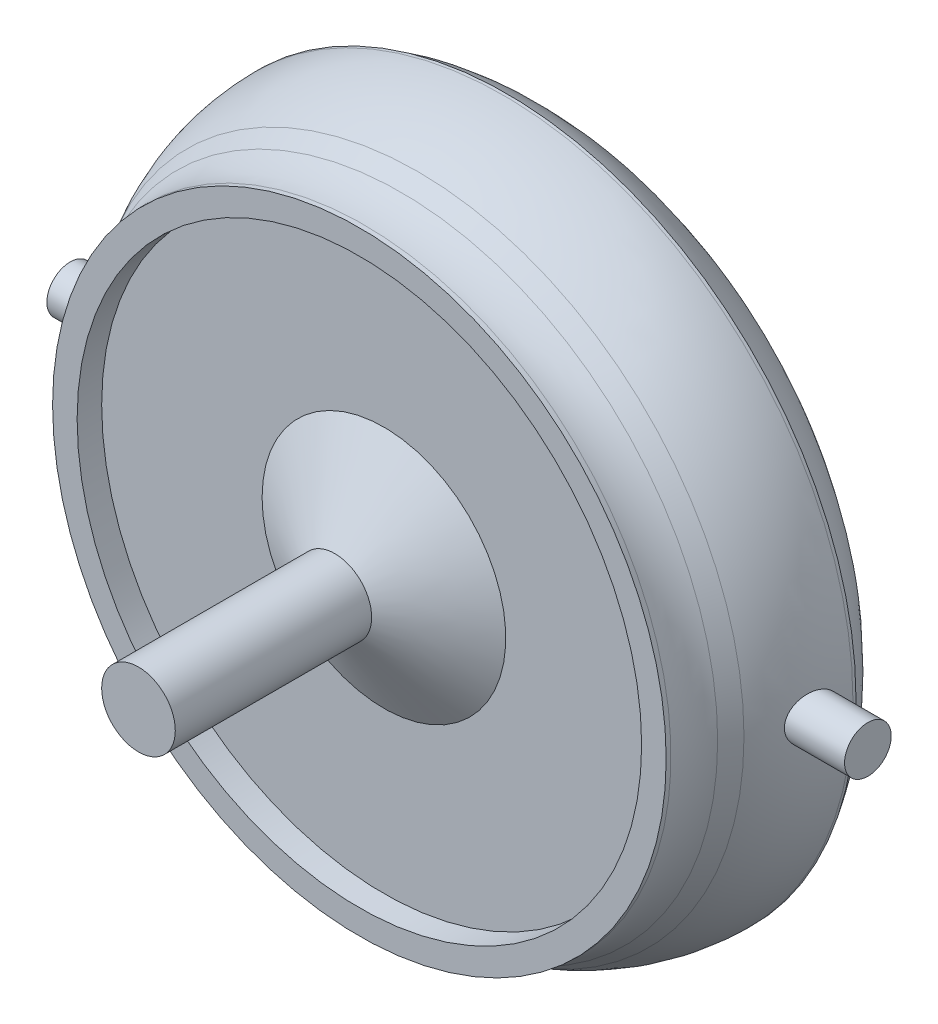
ISO-10303-21;
HEADER;
FILE_DESCRIPTION(('STEP AP214'),'2;1');
FILE_NAME('part.step','',(''),(''),'','','');
FILE_SCHEMA(('AUTOMOTIVE_DESIGN { 1 0 10303 214 1 1 1 1 }'));
ENDSEC;
DATA;
#1=APPLICATION_CONTEXT('core data for automotive mechanical design processes');
#2=APPLICATION_PROTOCOL_DEFINITION('international standard','automotive_design',2000,#1);
#3=PRODUCT_CONTEXT('',#1,'mechanical');
#4=PRODUCT('Part','Part','',(#3));
#5=PRODUCT_RELATED_PRODUCT_CATEGORY('part','',(#4));
#6=PRODUCT_DEFINITION_FORMATION('','',#4);
#7=PRODUCT_DEFINITION_CONTEXT('part definition',#1,'design');
#8=PRODUCT_DEFINITION('design','',#6,#7);
#9=PRODUCT_DEFINITION_SHAPE('','',#8);
#10=(LENGTH_UNIT() NAMED_UNIT(*) SI_UNIT(.MILLI.,.METRE.));
#11=(NAMED_UNIT(*) PLANE_ANGLE_UNIT() SI_UNIT($,.RADIAN.));
#12=(NAMED_UNIT(*) SI_UNIT($,.STERADIAN.) SOLID_ANGLE_UNIT());
#13=UNCERTAINTY_MEASURE_WITH_UNIT(LENGTH_MEASURE(1.E-05),#10,'distance_accuracy_value','');
#14=(GEOMETRIC_REPRESENTATION_CONTEXT(3) GLOBAL_UNCERTAINTY_ASSIGNED_CONTEXT((#13)) GLOBAL_UNIT_ASSIGNED_CONTEXT((#10,
#11,#12)) REPRESENTATION_CONTEXT('',''));
#15=CARTESIAN_POINT('',(0.,0.,0.));
#16=DIRECTION('',(0.,0.,1.));
#17=DIRECTION('',(1.,0.,0.));
#18=AXIS2_PLACEMENT_3D('',#15,#16,#17);
#19=CARTESIAN_POINT('',(0.,0.,-11.9615242270663));
#20=DIRECTION('',(0.,0.,-1.));
#21=DIRECTION('',(-1.,0.,0.));
#22=AXIS2_PLACEMENT_3D('',#19,#20,#21);
#23=TOROIDAL_SURFACE('',#22,155.,30.);
#24=CARTESIAN_POINT('',(0.,0.,-26.9615242270663));
#25=DIRECTION('',(0.,0.,-1.));
#26=DIRECTION('',(-1.,0.,0.));
#27=AXIS2_PLACEMENT_3D('',#24,#25,#26);
#28=CIRCLE('',#27,129.019237886467);
#29=CARTESIAN_POINT('',(-129.019237886467,0.,-26.9615242270663));
#30=VERTEX_POINT('',#29);
#31=EDGE_CURVE('E51',#30,#30,#28,.T.);
#32=ORIENTED_EDGE('',*,*,#31,.F.);
#33=EDGE_LOOP('',(#32));
#34=FACE_BOUND('',#33,.T.);
#35=CARTESIAN_POINT('',(0.,0.,-11.9615242270663));
#36=DIRECTION('',(0.,0.,-1.));
#37=DIRECTION('',(-1.,0.,0.));
#38=AXIS2_PLACEMENT_3D('',#35,#36,#37);
#39=CIRCLE('',#38,125.);
#40=CARTESIAN_POINT('',(-125.,0.,-11.9615242270663));
#41=VERTEX_POINT('',#40);
#42=EDGE_CURVE('E47',#41,#41,#39,.F.);
#43=ORIENTED_EDGE('',*,*,#42,.F.);
#44=EDGE_LOOP('',(#43));
#45=FACE_BOUND('',#44,.T.);
#46=ADVANCED_FACE('F33',(#34,#45),#23,.F.);
#47=CARTESIAN_POINT('',(0.,0.,-68.7564434701786));
#48=DIRECTION('',(0.,0.,1.));
#49=DIRECTION('',(1.,0.,0.));
#50=AXIS2_PLACEMENT_3D('',#47,#48,#49);
#51=TOROIDAL_SURFACE('',#50,72.3205080756888,70.);
#52=CARTESIAN_POINT('',(-141.901876558542,-5.57284493529392,-62.183888310166));
#53=CARTESIAN_POINT('',(-141.878561319438,-5.78945630783452,-62.0269910893366));
#54=CARTESIAN_POINT('',(-141.853622916282,-5.99929682454935,-61.8610397579026));
#55=CARTESIAN_POINT('',(-141.800477313605,-6.40407947126573,-61.5122109337051));
#56=CARTESIAN_POINT('',(-141.772269215553,-6.59901748143146,-61.3293287910489));
#57=CARTESIAN_POINT('',(-141.712568319138,-6.97276275395784,-60.9478691786247));
#58=CARTESIAN_POINT('',(-141.681071969036,-7.15155217686835,-60.7492747948304));
#59=CARTESIAN_POINT('',(-141.614851755165,-7.49154747204833,-60.33805964921));
#60=CARTESIAN_POINT('',(-141.580127807137,-7.65275288503358,-60.1254385212461));
#61=CARTESIAN_POINT('',(-141.507552444387,-7.95633768278864,-59.6879992350695));
#62=CARTESIAN_POINT('',(-141.469704343685,-8.09873661034738,-59.4631940861411));
#63=CARTESIAN_POINT('',(-141.390941550894,-8.36398749733395,-59.00284386631));
#64=CARTESIAN_POINT('',(-141.350026814121,-8.48683917184666,-58.7672986389275));
#65=CARTESIAN_POINT('',(-141.265269955458,-8.71219845695711,-58.2872529285281));
#66=CARTESIAN_POINT('',(-141.221428572344,-8.81471117596434,-58.0427547124994));
#67=CARTESIAN_POINT('',(-141.130974473612,-8.99882309070876,-57.5465052620613));
#68=CARTESIAN_POINT('',(-141.084361730083,-9.08042207576176,-57.294753954613));
#69=CARTESIAN_POINT('',(-140.98806235077,-9.22300272765961,-56.7830868345));
#70=CARTESIAN_POINT('',(-140.938348403544,-9.28375705096132,-56.52311281155));
#71=CARTESIAN_POINT('',(-140.836551833678,-9.38313145055921,-55.9994271508078));
#72=CARTESIAN_POINT('',(-140.784469196198,-9.42175138815121,-55.7357154896045));
#73=CARTESIAN_POINT('',(-140.678232592871,-9.47669672507641,-55.2064112858553));
#74=CARTESIAN_POINT('',(-140.624078741744,-9.49302335734745,-54.940818848143));
#75=CARTESIAN_POINT('',(-140.514013455229,-9.50337441104112,-54.40946994829));
#76=CARTESIAN_POINT('',(-140.45810140912,-9.49739099613038,-54.1437134613043));
#77=CARTESIAN_POINT('',(-140.343912401992,-9.46292489229523,-53.6092408569894));
#78=CARTESIAN_POINT('',(-140.285611111267,-9.43404656566222,-53.3405554036104));
#79=CARTESIAN_POINT('',(-140.168006346037,-9.3535491868192,-52.8067084734253));
#80=CARTESIAN_POINT('',(-140.108702432042,-9.30191989962789,-52.5415486380613));
#81=CARTESIAN_POINT('',(-139.989589076061,-9.17630918862779,-52.0166690220871));
#82=CARTESIAN_POINT('',(-139.929779592659,-9.10232591598169,-51.7569496933471));
#83=CARTESIAN_POINT('',(-139.810198156433,-8.93256405978146,-51.2448536374353));
#84=CARTESIAN_POINT('',(-139.750426198382,-8.83679461781457,-50.9924738804955));
#85=CARTESIAN_POINT('',(-139.630665510926,-8.6226948520336,-50.4934390781955));
#86=CARTESIAN_POINT('',(-139.57068406409,-8.50408743476979,-50.24690109832));
#87=CARTESIAN_POINT('',(-139.451891722548,-8.24592669096717,-49.764756584416));
#88=CARTESIAN_POINT('',(-139.393080806736,-8.10637374247117,-49.5291498531916));
#89=CARTESIAN_POINT('',(-139.277247869737,-7.80721706298104,-49.0705398537061));
#90=CARTESIAN_POINT('',(-139.220225952886,-7.64761216523718,-48.8475373199329));
#91=CARTESIAN_POINT('',(-139.108619256106,-7.30939647553219,-48.4157979231476));
#92=CARTESIAN_POINT('',(-139.054034388705,-7.13078636649986,-48.2070605479769));
#93=CARTESIAN_POINT('',(-138.948247532441,-6.75676035721924,-47.8065377983892));
#94=CARTESIAN_POINT('',(-138.897028503227,-6.56144287050496,-47.6146650507384));
#95=CARTESIAN_POINT('',(-138.798309451549,-6.15452395545548,-47.2481482983405));
#96=CARTESIAN_POINT('',(-138.750808014259,-5.94292878341069,-47.0734977326001));
#97=CARTESIAN_POINT('',(-138.660133465335,-5.50480511311159,-46.7427469370735));
#98=CARTESIAN_POINT('',(-138.616960667895,-5.27827553282374,-46.5866480537023));
#99=CARTESIAN_POINT('',(-138.535558137596,-4.81188470885437,-46.2943413559572));
#100=CARTESIAN_POINT('',(-138.497328267814,-4.57202383472071,-46.1581329905906));
#101=CARTESIAN_POINT('',(-138.427404421464,-4.08780490313876,-45.9104396877255));
#102=CARTESIAN_POINT('',(-138.39555368223,-3.84377632304629,-45.7983547640053));
#103=CARTESIAN_POINT('',(-138.337520020983,-3.34653047796274,-45.5950596849318));
#104=CARTESIAN_POINT('',(-138.311336782434,-3.09331372706293,-45.5038483637507));
#105=CARTESIAN_POINT('',(-138.265041931857,-2.57958923226706,-45.343134291057));
#106=CARTESIAN_POINT('',(-138.24492922099,-2.31908281722937,-45.2736276106595));
#107=CARTESIAN_POINT('',(-138.211087963322,-1.79270835441124,-45.1569506416123));
#108=CARTESIAN_POINT('',(-138.197359250174,-1.52684044652296,-45.1097797709604));
#109=CARTESIAN_POINT('',(-138.176879135872,-1.00132954589848,-45.0394969744971));
#110=CARTESIAN_POINT('',(-138.169896794102,-0.74180178545329,-45.0155885137483));
#111=CARTESIAN_POINT('',(-138.162182589643,-0.221570033399831,-44.989177358793));
#112=CARTESIAN_POINT('',(-138.161450563805,0.0391339273288663,-44.9866741058557));
#113=CARTESIAN_POINT('',(-138.166247859771,0.55978152705266,-45.0030945651715));
#114=CARTESIAN_POINT('',(-138.171776573655,0.819725237411282,-45.0220161970616));
#115=CARTESIAN_POINT('',(-138.189009482041,1.33697759950976,-45.0811119056314));
#116=CARTESIAN_POINT('',(-138.200713664114,1.59428625655174,-45.1212859395394));
#117=CARTESIAN_POINT('',(-138.229903976269,2.10066441701015,-45.2217837722982));
#118=CARTESIAN_POINT('',(-138.247302812302,2.34979940850628,-45.2818034883588));
#119=CARTESIAN_POINT('',(-138.287672434149,2.84198866756034,-45.4216161764594));
#120=CARTESIAN_POINT('',(-138.310643141445,3.08504302075427,-45.501408869856));
#121=CARTESIAN_POINT('',(-138.361831538505,3.56341202794515,-45.6800965259639));
#122=CARTESIAN_POINT('',(-138.390048506804,3.79872774092954,-45.7789888621648));
#123=CARTESIAN_POINT('',(-138.451361812716,4.26021243327956,-45.9951332064006));
#124=CARTESIAN_POINT('',(-138.484459980692,4.48637794076535,-46.1123921025929));
#125=CARTESIAN_POINT('',(-138.555708566284,4.93185852532601,-46.3665153911946));
#126=CARTESIAN_POINT('',(-138.593936237933,5.15098831578659,-46.5036828935794));
#127=CARTESIAN_POINT('',(-138.674514798486,5.57691864439927,-46.7950620211514));
#128=CARTESIAN_POINT('',(-138.716867213084,5.78371457444988,-46.9492799559652));
#129=CARTESIAN_POINT('',(-138.805156683842,6.18358037930661,-47.2735453697814));
#130=CARTESIAN_POINT('',(-138.851092768801,6.37665394605908,-47.4435885624108));
#131=CARTESIAN_POINT('',(-138.946051653792,6.74808082205725,-47.7984219044014));
#132=CARTESIAN_POINT('',(-138.995075844352,6.92642741523083,-47.9832187072487));
#133=CARTESIAN_POINT('',(-139.097434767302,7.27329509743211,-48.3730057210275));
#134=CARTESIAN_POINT('',(-139.150860561934,7.44124740905803,-48.5784783905118));
#135=CARTESIAN_POINT('',(-139.259817254212,7.75908170946009,-49.0022873056827));
#136=CARTESIAN_POINT('',(-139.315347296021,7.90897094331744,-49.2206183412289));
#137=CARTESIAN_POINT('',(-139.427986134095,8.18992691897425,-49.6688469270537));
#138=CARTESIAN_POINT('',(-139.485095722127,8.32098400927903,-49.8987503272609));
#139=CARTESIAN_POINT('',(-139.600288388695,8.56334741296888,-50.3684053274677));
#140=CARTESIAN_POINT('',(-139.658371146295,8.67466010271535,-50.6081537171587));
#141=CARTESIAN_POINT('',(-139.77665169668,8.87977315800518,-51.1029277239438));
#142=CARTESIAN_POINT('',(-139.836862702439,8.97298625640434,-51.3581938523499));
#143=CARTESIAN_POINT('',(-139.957215751094,9.13721648861556,-51.8757814216976));
#144=CARTESIAN_POINT('',(-140.017357794293,9.20823372053039,-52.1381028314503));
#145=CARTESIAN_POINT('',(-140.137061190812,9.32756824757597,-52.668012077562));
#146=CARTESIAN_POINT('',(-140.196622501062,9.37588387139261,-52.9356003001584));
#147=CARTESIAN_POINT('',(-140.31467902348,9.44942309559559,-53.4741589949875));
#148=CARTESIAN_POINT('',(-140.373174256908,9.47464715694905,-53.7451293995937));
#149=CARTESIAN_POINT('',(-140.489036662892,9.50184404327758,-54.2903245421222));
#150=CARTESIAN_POINT('',(-140.546394031223,9.5036646644192,-54.5645589846537));
#151=CARTESIAN_POINT('',(-140.659159787976,9.48355819556074,-55.1124515014833));
#152=CARTESIAN_POINT('',(-140.714568906681,9.46164010393435,-55.3861097548066));
#153=CARTESIAN_POINT('',(-140.823111370657,9.3941146435606,-55.9309911421508));
#154=CARTESIAN_POINT('',(-140.876244365595,9.34850364216308,-56.2022138962665));
#155=CARTESIAN_POINT('',(-140.97991352864,9.23380574933182,-56.740155072093));
#156=CARTESIAN_POINT('',(-141.030449730658,9.16471916454237,-57.0068735525919));
#157=CARTESIAN_POINT('',(-141.128048598641,9.00446709652955,-57.5304923014329));
#158=CARTESIAN_POINT('',(-141.175146727918,8.91358775271007,-57.7874735375605));
#159=CARTESIAN_POINT('',(-141.266343989518,8.70986439556162,-58.2931303845643));
#160=CARTESIAN_POINT('',(-141.310443139478,8.59702051142915,-58.5418060442842));
#161=CARTESIAN_POINT('',(-141.39547330494,8.3501003470431,-59.0289279415214));
#162=CARTESIAN_POINT('',(-141.436404546986,8.2160255871514,-59.2673749099715));
#163=CARTESIAN_POINT('',(-141.514977351412,7.92753711305576,-59.7322025865884));
#164=CARTESIAN_POINT('',(-141.552618957257,7.77312366764781,-59.9585834541652));
#165=CARTESIAN_POINT('',(-141.623870137768,7.44802350149583,-60.3934936530437));
#166=CARTESIAN_POINT('',(-141.657540708682,7.27768477459091,-60.6022731907726));
#167=CARTESIAN_POINT('',(-141.721577805998,6.91960886454151,-61.0048843599073));
#168=CARTESIAN_POINT('',(-141.751944370449,6.73187188181032,-61.1987161634513));
#169=CARTESIAN_POINT('',(-141.809349060175,6.34032876468857,-61.5699235092781));
#170=CARTESIAN_POINT('',(-141.83638737905,6.13652356610167,-61.7473000086006));
#171=CARTESIAN_POINT('',(-141.887136964781,5.7142899256262,-62.084229480993));
#172=CARTESIAN_POINT('',(-141.910848257096,5.49586159565998,-62.2437825904543));
#173=CARTESIAN_POINT('',(-141.954650643307,5.04911910430216,-62.5417141929113));
#174=CARTESIAN_POINT('',(-141.974787833277,4.82098648524845,-62.6803582011997));
#175=CARTESIAN_POINT('',(-142.011870181275,4.35366352564594,-62.938051394917));
#176=CARTESIAN_POINT('',(-142.028815369816,4.1144732908197,-63.0571007676418));
#177=CARTESIAN_POINT('',(-142.059544994696,3.62676360756113,-63.2746886024116));
#178=CARTESIAN_POINT('',(-142.073329657447,3.37824482888573,-63.373228533651));
#179=CARTESIAN_POINT('',(-142.097773250051,2.87364995234398,-63.5490550645994));
#180=CARTESIAN_POINT('',(-142.10843219201,2.61757388375401,-63.62634174663));
#181=CARTESIAN_POINT('',(-142.126585488182,2.10168760715869,-63.7585653872288));
#182=CARTESIAN_POINT('',(-142.134103322643,1.84192068403869,-63.8136680572708));
#183=CARTESIAN_POINT('',(-142.14611469215,1.31861313049039,-63.9019470566618));
#184=CARTESIAN_POINT('',(-142.150608175155,1.05507243520667,-63.9351230087187));
#185=CARTESIAN_POINT('',(-142.156586484354,0.526045951153952,-63.9793017860154));
#186=CARTESIAN_POINT('',(-142.158070639179,0.260559741604064,-63.9902996634119));
#187=CARTESIAN_POINT('',(-142.158033492139,-0.270396774102549,-63.9900246487678));
#188=CARTESIAN_POINT('',(-142.156512238533,-0.535867080446183,-63.9787521143238));
#189=CARTESIAN_POINT('',(-142.150465644747,-1.06431870233602,-63.9340707710117));
#190=CARTESIAN_POINT('',(-142.145946879657,-1.32730419063212,-63.9007104124431));
#191=CARTESIAN_POINT('',(-142.133896761814,-1.84949657966076,-63.8121532970213));
#192=CARTESIAN_POINT('',(-142.126365461991,-2.10870354669982,-63.7569569238318));
#193=CARTESIAN_POINT('',(-142.108275810943,-2.62123621324691,-63.6252087005617));
#194=CARTESIAN_POINT('',(-142.097720661988,-2.87456782960107,-63.5486794444105));
#195=CARTESIAN_POINT('',(-142.073555061383,-3.37375826574486,-63.3748472683064));
#196=CARTESIAN_POINT('',(-142.059945403279,-3.6196190076272,-63.2775497441635));
#197=CARTESIAN_POINT('',(-142.025841473794,-4.16262412991004,-63.0360121163153));
#198=CARTESIAN_POINT('',(-142.004476646821,-4.45721775028306,-62.8861175914508));
#199=CARTESIAN_POINT('',(-141.956854393575,-5.02891391835167,-62.5566910353438));
#200=CARTESIAN_POINT('',(-141.930596975298,-5.3060164946338,-62.377159052541));
#201=CARTESIAN_POINT('',(-141.901876558542,-5.57284493529392,-62.183888310166));
#202=B_SPLINE_CURVE_WITH_KNOTS('',3,(#52,#53,#54,#55,#56,#57,#58,#59,#60,#61,#62,#63,#64,#65,
#66,#67,#68,#69,#70,#71,#72,#73,#74,#75,#76,#77,#78,#79,#80,#81,#82,#83,#84,#85,#86,#87,#88,#89,
#90,#91,#92,#93,#94,#95,#96,#97,#98,#99,#100,#101,#102,#103,#104,#105,#106,#107,#108,#109,#110,
#111,#112,#113,#114,#115,#116,#117,#118,#119,#120,#121,#122,#123,#124,#125,#126,#127,#128,#129,
#130,#131,#132,#133,#134,#135,#136,#137,#138,#139,#140,#141,#142,#143,#144,#145,#146,#147,#148,
#149,#150,#151,#152,#153,#154,#155,#156,#157,#158,#159,#160,#161,#162,#163,#164,#165,#166,#167,
#168,#169,#170,#171,#172,#173,#174,#175,#176,#177,#178,#179,#180,#181,#182,#183,#184,#185,#186,
#187,#188,#189,#190,#191,#192,#193,#194,#195,#196,#197,#198,#199,#200,#201),.UNSPECIFIED.,.T.,
.F.,(4,2,2,2,2,2,2,2,2,2,2,2,2,2,2,2,2,2,2,2,2,2,2,2,2,2,2,2,2,2,2,2,2,2,2,2,2,2,2,2,2,2,2,2,2,
2,2,2,2,2,2,2,2,2,2,2,2,2,2,2,2,2,2,2,2,2,2,2,2,2,2,2,2,2,4),(0.,0.805142068939044,
1.61050592252173,2.41674885483747,3.22301284071485,4.02843229088305,4.83386347953739,
5.63909211622373,6.44432886443521,7.25808784352106,8.07185192193741,8.88557099306792,
9.69957590736317,10.527962233446,11.3567216069905,12.1855495437392,13.0140303394826,
13.8532808498451,14.6925162145199,15.5318004338731,16.3710545047625,17.205666810218,
18.0399599218413,18.8743135465635,19.7086440542515,20.518899940445,21.32911056136,
22.1391744361507,22.9492172020175,23.7304295290818,24.5116214644386,25.2927375523242,
26.0738520681773,26.8435134964692,27.6131640792083,28.3827088977808,29.1525430189856,
29.9356472317893,30.7190422136977,31.5022256221748,32.2857642425732,33.0969513311098,
33.907811962724,34.7190866903805,35.530098941766,36.3641485948677,37.1981945615284,
38.0323019218336,38.8663926308422,39.7059051091738,40.54509947405,41.3844225440861,
42.2237346510832,43.052577979102,43.8814164319712,44.7101955578018,45.5389637315892,
46.3526228803209,47.166272657547,47.979875083232,48.7934712824881,49.5956604249277,
50.3978418991726,51.1999658893323,52.0020867725302,52.7980995034153,53.5941259309015,
54.3903299291876,55.186521142911,55.9809716480533,56.7754081951425,57.5690065204228,
58.3623989111072,59.3541988861993,60.3459972402982),.UNSPECIFIED.);
#203=CARTESIAN_POINT('',(-141.901876558542,-5.57284493529392,-62.183888310166));
#204=VERTEX_POINT('',#203);
#205=EDGE_CURVE('E10',#204,#204,#202,.T.);
#206=ORIENTED_EDGE('',*,*,#205,.F.);
#207=EDGE_LOOP('',(#206));
#208=FACE_BOUND('',#207,.T.);
#209=CARTESIAN_POINT('',(141.901876558542,-5.57284493529392,-62.183888310166));
#210=CARTESIAN_POINT('',(141.924904395489,-5.35891130363185,-62.3388516524559));
#211=CARTESIAN_POINT('',(141.94634266758,-5.13842913346361,-62.4849412446777));
#212=CARTESIAN_POINT('',(141.986076247168,-4.68577175333587,-62.7583827832857));
#213=CARTESIAN_POINT('',(142.004370830941,-4.45359386671468,-62.8857304140273));
#214=CARTESIAN_POINT('',(142.037853725417,-3.97901391942708,-63.1207858599751));
#215=CARTESIAN_POINT('',(142.053039056631,-3.73660231790663,-63.22847482635));
#216=CARTESIAN_POINT('',(142.080314792134,-3.2434727164936,-63.4232569712241));
#217=CARTESIAN_POINT('',(142.092405219969,-2.99275477981266,-63.510350306416));
#218=CARTESIAN_POINT('',(142.113519762112,-2.48486679972227,-63.6632627270293));
#219=CARTESIAN_POINT('',(142.122544765186,-2.22769864969715,-63.7290879784803));
#220=CARTESIAN_POINT('',(142.137560564976,-1.7086675212279,-63.8390042480051));
#221=CARTESIAN_POINT('',(142.143551318293,-1.44680447568542,-63.8830949551968));
#222=CARTESIAN_POINT('',(142.152517097031,-0.92031433262267,-63.9492012581924));
#223=CARTESIAN_POINT('',(142.155492788569,-0.655687858682717,-63.9712217299458));
#224=CARTESIAN_POINT('',(142.158441046154,-0.125504787562789,-63.9930388109203));
#225=CARTESIAN_POINT('',(142.158413627148,0.140051804981195,-63.992835530754));
#226=CARTESIAN_POINT('',(142.155358782634,0.669648417734702,-63.9702304835733));
#227=CARTESIAN_POINT('',(142.152337583119,0.933690441563755,-63.9478747856707));
#228=CARTESIAN_POINT('',(142.143294068796,1.4589347235798,-63.881201230959));
#229=CARTESIAN_POINT('',(142.13727175653,1.7201369841721,-63.8368833927535));
#230=CARTESIAN_POINT('',(142.122206184087,2.23785195938252,-63.7266165944026));
#231=CARTESIAN_POINT('',(142.113162858491,2.49436457232458,-63.6606671658493));
#232=CARTESIAN_POINT('',(142.09202829033,3.00087618745111,-63.5076317895841));
#233=CARTESIAN_POINT('',(142.07993704615,3.25087518618445,-63.4205458306735));
#234=CARTESIAN_POINT('',(142.05267161392,3.74265647152948,-63.2258647750456));
#235=CARTESIAN_POINT('',(142.037496629618,3.98443661709336,-63.1182643817453));
#236=CARTESIAN_POINT('',(142.004033217053,4.45801047788462,-62.8833752068232));
#237=CARTESIAN_POINT('',(141.985744791079,4.68980420045694,-62.7560864396825));
#238=CARTESIAN_POINT('',(141.946025313432,5.14178393435851,-62.4827727865736));
#239=CARTESIAN_POINT('',(141.924594268734,5.36196997145167,-62.3367479421938));
#240=CARTESIAN_POINT('',(141.878568127843,5.7892084070165,-62.0270512414114));
#241=CARTESIAN_POINT('',(141.853973021824,5.99626076470516,-61.8633793302151));
#242=CARTESIAN_POINT('',(141.801509134661,6.39658120472276,-61.5189428398132));
#243=CARTESIAN_POINT('',(141.773628113429,6.58979314358131,-61.3381148747392));
#244=CARTESIAN_POINT('',(141.714677700088,6.96023406113468,-60.9612495899989));
#245=CARTESIAN_POINT('',(141.683608304174,7.1374630207632,-60.7652122521897));
#246=CARTESIAN_POINT('',(141.618312360152,7.47475288022827,-60.3593785390296));
#247=CARTESIAN_POINT('',(141.584085804637,7.63481373978538,-60.1495821313993));
#248=CARTESIAN_POINT('',(141.512532646922,7.93672512295105,-59.717763485718));
#249=CARTESIAN_POINT('',(141.475205940225,8.07857503230193,-59.4957408356351));
#250=CARTESIAN_POINT('',(141.397186846578,8.34436691323363,-59.0390082251074));
#251=CARTESIAN_POINT('',(141.356466825938,8.46813343538175,-58.8042008836697));
#252=CARTESIAN_POINT('',(141.272086676735,8.69542567009995,-58.3254964312317));
#253=CARTESIAN_POINT('',(141.228426534744,8.79895129020932,-58.0815992787151));
#254=CARTESIAN_POINT('',(141.13832698046,8.98515047519021,-57.5864569703648));
#255=CARTESIAN_POINT('',(141.091887426605,9.06782297683761,-57.3352114405929));
#256=CARTESIAN_POINT('',(140.996432915272,9.21184884106845,-56.8271611752938));
#257=CARTESIAN_POINT('',(140.94741792542,9.27320193559352,-56.5703563699106));
#258=CARTESIAN_POINT('',(140.846279556886,9.37505862557193,-56.0489805946382));
#259=CARTESIAN_POINT('',(140.79411988254,9.41522586392535,-55.7843509344719));
#260=CARTESIAN_POINT('',(140.687689809896,9.47308719987641,-55.2530684364423));
#261=CARTESIAN_POINT('',(140.633419392005,9.49078108881558,-54.9864155798173));
#262=CARTESIAN_POINT('',(140.523110036137,9.50367273521204,-54.4529580401547));
#263=CARTESIAN_POINT('',(140.467071251947,9.49887244357484,-54.1861533722903));
#264=CARTESIAN_POINT('',(140.353579027271,9.46689208311564,-53.6540963274358));
#265=CARTESIAN_POINT('',(140.296125096761,9.43970415331745,-53.3888445286575));
#266=CARTESIAN_POINT('',(140.179223047526,9.36251560143058,-52.8571535313717));
#267=CARTESIAN_POINT('',(140.119757625923,9.31212389395816,-52.5907748569622));
#268=CARTESIAN_POINT('',(140.000265715807,9.18878040218108,-52.063290308091));
#269=CARTESIAN_POINT('',(139.940238985801,9.1158184293091,-51.8021868717753));
#270=CARTESIAN_POINT('',(139.820162496804,8.94785299833817,-51.2871490214145));
#271=CARTESIAN_POINT('',(139.760112736349,8.85284777001507,-51.0332151849755));
#272=CARTESIAN_POINT('',(139.640571436542,8.6414829918182,-50.5343934672726));
#273=CARTESIAN_POINT('',(139.58107967053,8.52513254581438,-50.2895017827627));
#274=CARTESIAN_POINT('',(139.462630935788,8.27056473905512,-49.8080012167093));
#275=CARTESIAN_POINT('',(139.403684894243,8.1321445727919,-49.5714968150721));
#276=CARTESIAN_POINT('',(139.287551200702,7.83517572432053,-49.1110301557991));
#277=CARTESIAN_POINT('',(139.230363511615,7.67662746707572,-48.8870676335112));
#278=CARTESIAN_POINT('',(139.118386353347,7.34042178719028,-48.4533180013075));
#279=CARTESIAN_POINT('',(139.063596961731,7.16276374716175,-48.2435313497343));
#280=CARTESIAN_POINT('',(138.95707581976,6.78951054150409,-47.8397399467624));
#281=CARTESIAN_POINT('',(138.905343938561,6.59391614436853,-47.6457345198795));
#282=CARTESIAN_POINT('',(138.806152821873,6.18837592740065,-47.277102557904));
#283=CARTESIAN_POINT('',(138.758652179658,5.97861563368296,-47.1022831108346));
#284=CARTESIAN_POINT('',(138.667925861509,5.54431852096122,-46.7710258924541));
#285=CARTESIAN_POINT('',(138.624698416972,5.31978787977584,-46.6145805113477));
#286=CARTESIAN_POINT('',(138.543096848712,4.8574130261978,-46.3212899302314));
#287=CARTESIAN_POINT('',(138.504722975027,4.61956812881109,-46.1844457399582));
#288=CARTESIAN_POINT('',(138.433395962665,4.13228376395137,-45.931567066636));
#289=CARTESIAN_POINT('',(138.400442661674,3.88284464394277,-45.8155319604705));
#290=CARTESIAN_POINT('',(138.341446323893,3.38255926529051,-45.6087706632826));
#291=CARTESIAN_POINT('',(138.315212378648,3.13202641210287,-45.5173402771776));
#292=CARTESIAN_POINT('',(138.268684270229,2.62365465732354,-45.3557467193065));
#293=CARTESIAN_POINT('',(138.248389983909,2.36581590732354,-45.2855831066243));
#294=CARTESIAN_POINT('',(138.214059438189,1.8447938543976,-45.1671760369833));
#295=CARTESIAN_POINT('',(138.200021996969,1.58161157060803,-45.1189284404034));
#296=CARTESIAN_POINT('',(138.178423246868,1.05185480026272,-45.0447872761629));
#297=CARTESIAN_POINT('',(138.170861798456,0.785280386919049,-45.0188932268748));
#298=CARTESIAN_POINT('',(138.162477148061,0.259616007111319,-44.9901851463443));
#299=CARTESIAN_POINT('',(138.161439910915,0.00056920353605673,-44.986637990139));
#300=CARTESIAN_POINT('',(138.165550048419,-0.516895482620399,-45.0007057649443));
#301=CARTESIAN_POINT('',(138.170697267739,-0.775313380834011,-45.0183201644554));
#302=CARTESIAN_POINT('',(138.187097606659,-1.28963956599237,-45.0745513513987));
#303=CARTESIAN_POINT('',(138.198350348723,-1.54554800711383,-45.1131668402253));
#304=CARTESIAN_POINT('',(138.226792871949,-2.05304552156152,-45.2110584799447));
#305=CARTESIAN_POINT('',(138.243982676291,-2.30463457801946,-45.2703347115037));
#306=CARTESIAN_POINT('',(138.283901906207,-2.79993080405074,-45.4085327599611));
#307=CARTESIAN_POINT('',(138.30659040099,-3.04368179427305,-45.4873095088587));
#308=CARTESIAN_POINT('',(138.357260130791,-3.5236349303332,-45.6640983963936));
#309=CARTESIAN_POINT('',(138.385243279097,-3.75983431112336,-45.7621174889711));
#310=CARTESIAN_POINT('',(138.446112987518,-4.22301868738597,-45.9765720343077));
#311=CARTESIAN_POINT('',(138.478998897506,-4.45000489949603,-46.0930050454232));
#312=CARTESIAN_POINT('',(138.549249968673,-4.89337330666867,-46.3434019725162));
#313=CARTESIAN_POINT('',(138.586615343805,-5.10975499453005,-46.4773667258925));
#314=CARTESIAN_POINT('',(138.666297714202,-5.53559632800626,-46.76521786532));
#315=CARTESIAN_POINT('',(138.708711378401,-5.74476873981896,-46.9195024418443));
#316=CARTESIAN_POINT('',(138.79722209956,-6.14931841513855,-47.2442563003502));
#317=CARTESIAN_POINT('',(138.843319288833,-6.34469518262568,-47.4147261637545));
#318=CARTESIAN_POINT('',(138.938654121261,-6.72047077938115,-47.7706219568045));
#319=CARTESIAN_POINT('',(138.98789166984,-6.9008700593408,-47.9560474360858));
#320=CARTESIAN_POINT('',(139.088978915987,-7.24569732628385,-48.3406430665067));
#321=CARTESIAN_POINT('',(139.14082947985,-7.41011996291234,-48.539817784142));
#322=CARTESIAN_POINT('',(139.248469391565,-7.7275356774083,-48.9578497248269));
#323=CARTESIAN_POINT('',(139.304333247286,-7.87991343445714,-49.1771552299012));
#324=CARTESIAN_POINT('',(139.417673743345,-8.16551779198427,-49.6275076820061));
#325=CARTESIAN_POINT('',(139.475150425912,-8.29874389043591,-49.858554936611));
#326=CARTESIAN_POINT('',(139.591158820346,-8.54525460746905,-50.3308837640079));
#327=CARTESIAN_POINT('',(139.649690818093,-8.65853373020598,-50.5721681347049));
#328=CARTESIAN_POINT('',(139.7672261037,-8.86436109664874,-51.0632178193519));
#329=CARTESIAN_POINT('',(139.826229241852,-8.95691567390404,-51.3129805153284));
#330=CARTESIAN_POINT('',(139.945616229292,-9.12269827507674,-51.8254631009232));
#331=CARTESIAN_POINT('',(140.005999342813,-9.19541100568035,-52.0883500227234));
#332=CARTESIAN_POINT('',(140.126206417905,-9.31799255065112,-52.6195198425665));
#333=CARTESIAN_POINT('',(140.18603038237,-9.367861483332,-52.887802712655));
#334=CARTESIAN_POINT('',(140.304633836968,-9.44436205098806,-53.4278955233988));
#335=CARTESIAN_POINT('',(140.363413312597,-9.47099336355626,-53.6997055129376));
#336=CARTESIAN_POINT('',(140.479479141722,-9.50075734865094,-54.2449211410687));
#337=CARTESIAN_POINT('',(140.536765532764,-9.50389061266259,-54.5183267393235));
#338=CARTESIAN_POINT('',(140.649505371803,-9.48653576058125,-55.0650807513647));
#339=CARTESIAN_POINT('',(140.704956749571,-9.46602184208419,-55.3384287765652));
#340=CARTESIAN_POINT('',(140.813581983297,-9.40138180992485,-55.8826746088415));
#341=CARTESIAN_POINT('',(140.866756653243,-9.35726421269421,-56.1535732638461));
#342=CARTESIAN_POINT('',(140.970556625494,-9.24560537971198,-56.6911090313069));
#343=CARTESIAN_POINT('',(141.021180967691,-9.17805539686139,-56.9577445134224));
#344=CARTESIAN_POINT('',(141.119591825468,-9.01991379844789,-57.484625659514));
#345=CARTESIAN_POINT('',(141.167378423933,-8.92932285628207,-57.7448715099903));
#346=CARTESIAN_POINT('',(141.259220657618,-8.72714214981479,-58.2532370234915));
#347=CARTESIAN_POINT('',(141.303320550456,-8.61587799273815,-58.5014782000588));
#348=CARTESIAN_POINT('',(141.388385697578,-8.37222598195233,-58.9879216601428));
#349=CARTESIAN_POINT('',(141.429351048398,-8.23983877917013,-59.2261242527221));
#350=CARTESIAN_POINT('',(141.507980144957,-7.95496888278028,-59.6904093721741));
#351=CARTESIAN_POINT('',(141.545647464674,-7.80250840222564,-59.9165049132143));
#352=CARTESIAN_POINT('',(141.61763105102,-7.47848821792486,-60.3550195032487));
#353=CARTESIAN_POINT('',(141.651948204924,-7.30693359706067,-60.5674421683267));
#354=CARTESIAN_POINT('',(141.726385327054,-6.89499004170765,-61.0347406816505));
#355=CARTESIAN_POINT('',(141.765418367632,-6.64882078112845,-61.2847282510264));
#356=CARTESIAN_POINT('',(141.837862222081,-6.12990436341581,-61.7563305829325));
#357=CARTESIAN_POINT('',(141.871273116836,-5.85715758873323,-61.9779457536358));
#358=CARTESIAN_POINT('',(141.901876558542,-5.57284493529392,-62.183888310166));
#359=B_SPLINE_CURVE_WITH_KNOTS('',3,(#209,#210,#211,#212,#213,#214,#215,#216,#217,#218,#219,
#220,#221,#222,#223,#224,#225,#226,#227,#228,#229,#230,#231,#232,#233,#234,#235,#236,#237,#238,
#239,#240,#241,#242,#243,#244,#245,#246,#247,#248,#249,#250,#251,#252,#253,#254,#255,#256,#257,
#258,#259,#260,#261,#262,#263,#264,#265,#266,#267,#268,#269,#270,#271,#272,#273,#274,#275,#276,
#277,#278,#279,#280,#281,#282,#283,#284,#285,#286,#287,#288,#289,#290,#291,#292,#293,#294,#295,
#296,#297,#298,#299,#300,#301,#302,#303,#304,#305,#306,#307,#308,#309,#310,#311,#312,#313,#314,
#315,#316,#317,#318,#319,#320,#321,#322,#323,#324,#325,#326,#327,#328,#329,#330,#331,#332,#333,
#334,#335,#336,#337,#338,#339,#340,#341,#342,#343,#344,#345,#346,#347,#348,#349,#350,#351,#352,
#353,#354,#355,#356,#357,#358),.UNSPECIFIED.,.T.,.F.,(4,2,2,2,2,2,2,2,2,2,2,2,2,2,2,2,2,2,2,2,2,
2,2,2,2,2,2,2,2,2,2,2,2,2,2,2,2,2,2,2,2,2,2,2,2,2,2,2,2,2,2,2,2,2,2,2,2,2,2,2,2,2,2,2,2,2,2,2,2,
2,2,2,2,2,4),(0.,0.795185130434362,1.59055307977485,2.38667967196775,3.18280020698701,
3.97868972369676,4.77459062415677,5.5703156484339,6.36603671220776,7.16010642621556,
7.9541754675842,8.74826170476345,9.54234836266835,10.3366403226325,11.1309316983903,
11.9252213110989,12.7195133901332,13.5168637507133,14.3142150624497,15.1115682448742,
15.9089483150615,16.7136133584168,17.5182820774066,18.3229918152169,19.1277116706341,
19.944849842484,20.761995601167,21.5790704906472,22.3964324022098,23.2281052351855,
24.060154047367,24.8922697018993,25.7240312754832,26.563930696162,27.4038123870361,
28.2437212204808,29.0835940843458,29.9140489490647,30.7441586509545,31.5743110997866,
32.4044386860044,33.2073897645543,34.0103241946764,34.8131068988724,35.6158723059587,
36.3921583624492,37.168424921928,37.9446434862984,38.7208650813097,39.4914771732679,
40.2623682690886,41.0331572320884,41.8039830250588,42.5931509784386,43.3823472917691,
44.1715198485822,44.9609557839558,45.7784972031842,46.5960600488997,47.4138478004725,
48.2313852889074,49.0684798413274,49.9055700581773,50.7426718889292,51.579752648358,
52.4177476459605,53.2554404907078,54.09344637577,54.9314277720125,55.757184774607,
56.5829163356179,57.4077417052263,58.2323480281723,59.2891451550725,60.3459270768902),.UNSPECIFIED.);
#360=CARTESIAN_POINT('',(141.901876558542,-5.57284493529392,-62.183888310166));
#361=VERTEX_POINT('',#360);
#362=EDGE_CURVE('E43',#361,#361,#359,.T.);
#363=ORIENTED_EDGE('',*,*,#362,.F.);
#364=EDGE_LOOP('',(#363));
#365=FACE_BOUND('',#364,.T.);
#366=CARTESIAN_POINT('',(0.,0.,-68.7564434701786));
#367=DIRECTION('',(0.,0.,1.));
#368=DIRECTION('',(1.,0.,0.));
#369=AXIS2_PLACEMENT_3D('',#366,#367,#368);
#370=CIRCLE('',#369,142.320508075689);
#371=CARTESIAN_POINT('',(142.320508075689,0.,-68.7564434701786));
#372=VERTEX_POINT('',#371);
#373=EDGE_CURVE('E149',#372,#372,#370,.F.);
#374=ORIENTED_EDGE('',*,*,#373,.F.);
#375=EDGE_LOOP('',(#374));
#376=FACE_BOUND('',#375,.T.);
#377=CARTESIAN_POINT('',(0.,0.,-33.7564434701786));
#378=DIRECTION('',(0.,0.,1.));
#379=DIRECTION('',(1.,0.,0.));
#380=AXIS2_PLACEMENT_3D('',#377,#378,#379);
#381=CIRCLE('',#380,132.9422863406);
#382=CARTESIAN_POINT('',(132.9422863406,0.,-33.7564434701786));
#383=VERTEX_POINT('',#382);
#384=EDGE_CURVE('E152',#383,#383,#381,.T.);
#385=ORIENTED_EDGE('',*,*,#384,.F.);
#386=EDGE_LOOP('',(#385));
#387=FACE_BOUND('',#386,.T.);
#388=ADVANCED_FACE('F57',(#208,#365,#376,#387),#51,.T.);
#389=CARTESIAN_POINT('',(0.,0.,-40.));
#390=DIRECTION('',(0.,0.,-1.));
#391=DIRECTION('',(-1.,0.,0.));
#392=AXIS2_PLACEMENT_3D('',#389,#390,#391);
#393=TOROIDAL_SURFACE('',#392,90.3589838486225,60.);
#394=CARTESIAN_POINT('',(0.,0.,-100.));
#395=DIRECTION('',(0.,0.,-1.));
#396=DIRECTION('',(-1.,0.,0.));
#397=AXIS2_PLACEMENT_3D('',#394,#395,#396);
#398=CIRCLE('',#397,90.3589838486225);
#399=CARTESIAN_POINT('',(-90.3589838486225,0.,-100.));
#400=VERTEX_POINT('',#399);
#401=EDGE_CURVE('E146',#400,#400,#398,.T.);
#402=ORIENTED_EDGE('',*,*,#401,.F.);
#403=EDGE_LOOP('',(#402));
#404=FACE_BOUND('',#403,.T.);
#405=CARTESIAN_POINT('',(0.,0.,-70.));
#406=DIRECTION('',(0.,0.,-1.));
#407=DIRECTION('',(-1.,0.,0.));
#408=AXIS2_PLACEMENT_3D('',#405,#406,#407);
#409=CIRCLE('',#408,142.320508075689);
#410=CARTESIAN_POINT('',(-142.320508075689,0.,-70.));
#411=VERTEX_POINT('',#410);
#412=EDGE_CURVE('E162',#411,#411,#409,.T.);
#413=ORIENTED_EDGE('',*,*,#412,.T.);
#414=EDGE_LOOP('',(#413));
#415=FACE_BOUND('',#414,.T.);
#416=ADVANCED_FACE('F95',(#404,#415),#393,.T.);
#417=CARTESIAN_POINT('',(0.,0.,-20.));
#418=DIRECTION('',(0.,0.,-1.));
#419=DIRECTION('',(-1.,0.,0.));
#420=AXIS2_PLACEMENT_3D('',#417,#418,#419);
#421=PLANE('',#420);
#422=CARTESIAN_POINT('',(0.,0.,-20.));
#423=DIRECTION('',(0.,0.,-1.));
#424=DIRECTION('',(-1.,0.,0.));
#425=AXIS2_PLACEMENT_3D('',#422,#423,#424);
#426=CIRCLE('',#425,49.6410161513776);
#427=CARTESIAN_POINT('',(-49.6410161513776,0.,-20.));
#428=VERTEX_POINT('',#427);
#429=EDGE_CURVE('E134',#428,#428,#426,.T.);
#430=ORIENTED_EDGE('',*,*,#429,.T.);
#431=EDGE_LOOP('',(#430));
#432=FACE_BOUND('',#431,.T.);
#433=CARTESIAN_POINT('',(0.,0.,-20.));
#434=DIRECTION('',(0.,0.,1.));
#435=DIRECTION('',(1.,0.,0.));
#436=AXIS2_PLACEMENT_3D('',#433,#434,#435);
#437=CIRCLE('',#436,115.);
#438=CARTESIAN_POINT('',(115.,0.,-20.));
#439=VERTEX_POINT('',#438);
#440=EDGE_CURVE('E137',#439,#439,#437,.T.);
#441=ORIENTED_EDGE('',*,*,#440,.T.);
#442=EDGE_LOOP('',(#441));
#443=FACE_BOUND('',#442,.T.);
#444=ADVANCED_FACE('F91',(#432,#443),#421,.F.);
#445=CARTESIAN_POINT('',(0.,0.,80.));
#446=DIRECTION('',(0.,0.,-1.));
#447=DIRECTION('',(-1.,0.,0.));
#448=AXIS2_PLACEMENT_3D('',#445,#446,#447);
#449=CYLINDRICAL_SURFACE('',#448,15.);
#450=CARTESIAN_POINT('',(0.,0.,80.));
#451=DIRECTION('',(0.,0.,1.));
#452=DIRECTION('',(1.,0.,0.));
#453=AXIS2_PLACEMENT_3D('',#450,#451,#452);
#454=CIRCLE('',#453,15.);
#455=CARTESIAN_POINT('',(15.,0.,80.));
#456=VERTEX_POINT('',#455);
#457=EDGE_CURVE('E143',#456,#456,#454,.T.);
#458=ORIENTED_EDGE('',*,*,#457,.F.);
#459=EDGE_LOOP('',(#458));
#460=FACE_BOUND('',#459,.T.);
#461=CARTESIAN_POINT('',(0.,0.,0.));
#462=DIRECTION('',(0.,0.,-1.));
#463=DIRECTION('',(-1.,0.,0.));
#464=AXIS2_PLACEMENT_3D('',#461,#462,#463);
#465=CIRCLE('',#464,15.);
#466=CARTESIAN_POINT('',(-15.,0.,0.));
#467=VERTEX_POINT('',#466);
#468=EDGE_CURVE('E130',#467,#467,#465,.T.);
#469=ORIENTED_EDGE('',*,*,#468,.F.);
#470=EDGE_LOOP('',(#469));
#471=FACE_BOUND('',#470,.T.);
#472=ADVANCED_FACE('F94',(#460,#471),#449,.T.);
#473=CARTESIAN_POINT('',(0.,0.,80.));
#474=DIRECTION('',(0.,0.,1.));
#475=DIRECTION('',(1.,0.,0.));
#476=AXIS2_PLACEMENT_3D('',#473,#474,#475);
#477=PLANE('',#476);
#478=ORIENTED_EDGE('',*,*,#457,.T.);
#479=EDGE_LOOP('',(#478));
#480=FACE_BOUND('',#479,.T.);
#481=ADVANCED_FACE('F102',(#480),#477,.T.);
#482=CARTESIAN_POINT('',(0.,0.,0.));
#483=DIRECTION('',(0.,0.,-1.));
#484=DIRECTION('',(-1.,0.,0.));
#485=AXIS2_PLACEMENT_3D('',#482,#483,#484);
#486=CONICAL_SURFACE('',#485,15.,1.0471975511966);
#487=CARTESIAN_POINT('',(-49.6410161513776,0.,-20.));
#488=CARTESIAN_POINT('',(-49.2801722331341,0.,-19.7916666666667));
#489=CARTESIAN_POINT('',(-48.9193283148906,0.,-19.5833333333333));
#490=CARTESIAN_POINT('',(-48.1976404784035,0.,-19.1666666666667));
#491=CARTESIAN_POINT('',(-47.83679656016,0.,-18.9583333333333));
#492=CARTESIAN_POINT('',(-47.115108723673,0.,-18.5416666666667));
#493=CARTESIAN_POINT('',(-46.7542648054295,0.,-18.3333333333333));
#494=CARTESIAN_POINT('',(-46.0325769689425,0.,-17.9166666666667));
#495=CARTESIAN_POINT('',(-45.6717330506989,0.,-17.7083333333333));
#496=CARTESIAN_POINT('',(-44.9500452142119,0.,-17.2916666666667));
#497=CARTESIAN_POINT('',(-44.5892012959684,0.,-17.0833333333333));
#498=CARTESIAN_POINT('',(-43.8675134594814,0.,-16.6666666666667));
#499=CARTESIAN_POINT('',(-43.5066695412378,0.,-16.4583333333333));
#500=CARTESIAN_POINT('',(-42.7849817047508,0.,-16.0416666666667));
#501=CARTESIAN_POINT('',(-42.4241377865073,0.,-15.8333333333333));
#502=CARTESIAN_POINT('',(-41.7024499500203,0.,-15.4166666666667));
#503=CARTESIAN_POINT('',(-41.3416060317767,0.,-15.2083333333333));
#504=CARTESIAN_POINT('',(-40.6199181952897,0.,-14.7916666666667));
#505=CARTESIAN_POINT('',(-40.2590742770462,0.,-14.5833333333333));
#506=CARTESIAN_POINT('',(-39.5373864405592,0.,-14.1666666666667));
#507=CARTESIAN_POINT('',(-39.1765425223156,0.,-13.9583333333333));
#508=CARTESIAN_POINT('',(-38.4548546858286,0.,-13.5416666666667));
#509=CARTESIAN_POINT('',(-38.0940107675851,0.,-13.3333333333333));
#510=CARTESIAN_POINT('',(-37.3723229310981,0.,-12.9166666666667));
#511=CARTESIAN_POINT('',(-37.0114790128545,0.,-12.7083333333333));
#512=CARTESIAN_POINT('',(-36.2897911763675,0.,-12.2916666666667));
#513=CARTESIAN_POINT('',(-35.928947258124,0.,-12.0833333333333));
#514=CARTESIAN_POINT('',(-35.2072594216369,0.,-11.6666666666667));
#515=CARTESIAN_POINT('',(-34.8464155033934,0.,-11.4583333333333));
#516=CARTESIAN_POINT('',(-34.1247276669064,0.,-11.0416666666667));
#517=CARTESIAN_POINT('',(-33.7638837486629,0.,-10.8333333333333));
#518=CARTESIAN_POINT('',(-33.0421959121758,0.,-10.4166666666667));
#519=CARTESIAN_POINT('',(-32.6813519939323,0.,-10.2083333333333));
#520=CARTESIAN_POINT('',(-31.9596641574453,0.,-9.79166666666667));
#521=CARTESIAN_POINT('',(-31.5988202392018,0.,-9.58333333333333));
#522=CARTESIAN_POINT('',(-30.8771324027147,0.,-9.16666666666666));
#523=CARTESIAN_POINT('',(-30.5162884844712,0.,-8.95833333333333));
#524=CARTESIAN_POINT('',(-29.7946006479842,0.,-8.54166666666667));
#525=CARTESIAN_POINT('',(-29.4337567297407,0.,-8.33333333333333));
#526=CARTESIAN_POINT('',(-28.7120688932536,0.,-7.91666666666667));
#527=CARTESIAN_POINT('',(-28.3512249750101,0.,-7.70833333333333));
#528=CARTESIAN_POINT('',(-27.6295371385231,0.,-7.29166666666667));
#529=CARTESIAN_POINT('',(-27.2686932202796,0.,-7.08333333333333));
#530=CARTESIAN_POINT('',(-26.5470053837925,0.,-6.66666666666667));
#531=CARTESIAN_POINT('',(-26.186161465549,0.,-6.45833333333333));
#532=CARTESIAN_POINT('',(-25.464473629062,0.,-6.04166666666667));
#533=CARTESIAN_POINT('',(-25.1036297108185,0.,-5.83333333333333));
#534=CARTESIAN_POINT('',(-24.3819418743314,0.,-5.41666666666667));
#535=CARTESIAN_POINT('',(-24.0210979560879,0.,-5.20833333333333));
#536=CARTESIAN_POINT('',(-23.2994101196009,0.,-4.79166666666667));
#537=CARTESIAN_POINT('',(-22.9385662013574,0.,-4.58333333333333));
#538=CARTESIAN_POINT('',(-22.2168783648703,0.,-4.16666666666667));
#539=CARTESIAN_POINT('',(-21.8560344466268,0.,-3.95833333333333));
#540=CARTESIAN_POINT('',(-21.1343466101398,0.,-3.54166666666667));
#541=CARTESIAN_POINT('',(-20.7735026918963,0.,-3.33333333333333));
#542=CARTESIAN_POINT('',(-20.0518148554092,0.,-2.91666666666667));
#543=CARTESIAN_POINT('',(-19.6909709371657,0.,-2.70833333333333));
#544=CARTESIAN_POINT('',(-18.9692831006787,0.,-2.29166666666667));
#545=CARTESIAN_POINT('',(-18.6084391824352,0.,-2.08333333333333));
#546=CARTESIAN_POINT('',(-17.8867513459481,0.,-1.66666666666667));
#547=CARTESIAN_POINT('',(-17.5259074277046,0.,-1.45833333333333));
#548=CARTESIAN_POINT('',(-16.8042195912176,0.,-1.04166666666667));
#549=CARTESIAN_POINT('',(-16.4433756729741,0.,-0.833333333333334));
#550=CARTESIAN_POINT('',(-15.721687836487,0.,-0.416666666666667));
#551=CARTESIAN_POINT('',(-15.3608439182435,0.,-0.208333333333333));
#552=CARTESIAN_POINT('',(-15.,0.,0.));
#553=B_SPLINE_CURVE_WITH_KNOTS('',3,(#487,#488,#489,#490,#491,#492,#493,#494,#495,#496,#497,
#498,#499,#500,#501,#502,#503,#504,#505,#506,#507,#508,#509,#510,#511,#512,#513,#514,#515,#516,
#517,#518,#519,#520,#521,#522,#523,#524,#525,#526,#527,#528,#529,#530,#531,#532,#533,#534,#535,
#536,#537,#538,#539,#540,#541,#542,#543,#544,#545,#546,#547,#548,#549,#550,#551,#552),
.UNSPECIFIED.,.F.,.F.,(4,2,2,2,2,2,2,2,2,2,2,2,2,2,2,2,2,2,2,2,2,2,2,2,2,2,2,2,2,2,2,2,4),(0.,
1.25,2.5,3.75,5.00000000000001,6.25000000000001,7.50000000000001,8.75000000000001,10.,11.25,
12.5,13.75,15.,16.25,17.5,18.75,20.,21.25,22.5,23.75,25.,26.25,27.5,28.75,30.,31.25,32.5,33.75,
35.0000000000001,36.2500000000001,37.5000000000001,38.7500000000001,40.0000000000001),.UNSPECIFIED.);
#554=EDGE_CURVE('BSEAM86',#428,#467,#553,.T.);
#555=ORIENTED_EDGE('',*,*,#429,.F.);
#556=ORIENTED_EDGE('',*,*,#468,.T.);
#557=ORIENTED_EDGE('',*,*,#554,.T.);
#558=ORIENTED_EDGE('',*,*,#554,.F.);
#559=EDGE_LOOP('',(#555,#557,#556,#558));
#560=FACE_BOUND('',#559,.T.);
#561=ADVANCED_FACE('F86',(#560),#486,.T.);
#562=CARTESIAN_POINT('',(0.,0.,-10.));
#563=DIRECTION('',(0.,0.,1.));
#564=DIRECTION('',(1.,0.,0.));
#565=AXIS2_PLACEMENT_3D('',#562,#563,#564);
#566=PLANE('',#565);
#567=CARTESIAN_POINT('',(0.,0.,-10.));
#568=DIRECTION('',(0.,0.,1.));
#569=DIRECTION('',(1.,0.,0.));
#570=AXIS2_PLACEMENT_3D('',#567,#568,#569);
#571=CIRCLE('',#570,125.);
#572=CARTESIAN_POINT('',(125.,0.,-10.));
#573=VERTEX_POINT('',#572);
#574=EDGE_CURVE('E129',#573,#573,#571,.T.);
#575=ORIENTED_EDGE('',*,*,#574,.T.);
#576=EDGE_LOOP('',(#575));
#577=FACE_BOUND('',#576,.T.);
#578=CARTESIAN_POINT('',(0.,0.,-10.));
#579=DIRECTION('',(0.,0.,1.));
#580=DIRECTION('',(1.,0.,0.));
#581=AXIS2_PLACEMENT_3D('',#578,#579,#580);
#582=CIRCLE('',#581,115.);
#583=CARTESIAN_POINT('',(115.,0.,-10.));
#584=VERTEX_POINT('',#583);
#585=EDGE_CURVE('E131',#584,#584,#582,.T.);
#586=ORIENTED_EDGE('',*,*,#585,.F.);
#587=EDGE_LOOP('',(#586));
#588=FACE_BOUND('',#587,.T.);
#589=ADVANCED_FACE('F83',(#577,#588),#566,.T.);
#590=CARTESIAN_POINT('',(0.,0.,-10.));
#591=DIRECTION('',(0.,0.,-1.));
#592=DIRECTION('',(-1.,0.,0.));
#593=AXIS2_PLACEMENT_3D('',#590,#591,#592);
#594=CYLINDRICAL_SURFACE('',#593,125.);
#595=ORIENTED_EDGE('',*,*,#42,.T.);
#596=EDGE_LOOP('',(#595));
#597=FACE_BOUND('',#596,.T.);
#598=ORIENTED_EDGE('',*,*,#574,.F.);
#599=EDGE_LOOP('',(#598));
#600=FACE_BOUND('',#599,.T.);
#601=ADVANCED_FACE('F81',(#597,#600),#594,.T.);
#602=CARTESIAN_POINT('',(0.,0.,-10.));
#603=DIRECTION('',(0.,0.,-1.));
#604=DIRECTION('',(-1.,0.,0.));
#605=AXIS2_PLACEMENT_3D('',#602,#603,#604);
#606=CYLINDRICAL_SURFACE('',#605,115.);
#607=ORIENTED_EDGE('',*,*,#585,.T.);
#608=EDGE_LOOP('',(#607));
#609=FACE_BOUND('',#608,.T.);
#610=ORIENTED_EDGE('',*,*,#440,.F.);
#611=EDGE_LOOP('',(#610));
#612=FACE_BOUND('',#611,.T.);
#613=ADVANCED_FACE('F78',(#609,#612),#606,.F.);
#614=CARTESIAN_POINT('',(0.,0.,-20.));
#615=DIRECTION('',(0.,0.,-1.));
#616=DIRECTION('',(-1.,0.,0.));
#617=AXIS2_PLACEMENT_3D('',#614,#615,#616);
#618=CONICAL_SURFACE('',#617,125.,0.523598775598299);
#619=ORIENTED_EDGE('',*,*,#31,.T.);
#620=EDGE_LOOP('',(#619));
#621=FACE_BOUND('',#620,.T.);
#622=ORIENTED_EDGE('',*,*,#384,.T.);
#623=EDGE_LOOP('',(#622));
#624=FACE_BOUND('',#623,.T.);
#625=ADVANCED_FACE('F76',(#621,#624),#618,.T.);
#626=CARTESIAN_POINT('',(0.,0.,-70.));
#627=DIRECTION('',(0.,0.,1.));
#628=DIRECTION('',(1.,0.,0.));
#629=AXIS2_PLACEMENT_3D('',#626,#627,#628);
#630=CYLINDRICAL_SURFACE('',#629,142.320508075689);
#631=ORIENTED_EDGE('',*,*,#373,.T.);
#632=EDGE_LOOP('',(#631));
#633=FACE_BOUND('',#632,.T.);
#634=ORIENTED_EDGE('',*,*,#412,.F.);
#635=EDGE_LOOP('',(#634));
#636=FACE_BOUND('',#635,.T.);
#637=ADVANCED_FACE('F72',(#633,#636),#630,.T.);
#638=CARTESIAN_POINT('',(0.,0.,-100.));
#639=DIRECTION('',(0.,0.,-1.));
#640=DIRECTION('',(-1.,0.,0.));
#641=AXIS2_PLACEMENT_3D('',#638,#639,#640);
#642=PLANE('',#641);
#643=ORIENTED_EDGE('',*,*,#401,.T.);
#644=EDGE_LOOP('',(#643));
#645=FACE_BOUND('',#644,.T.);
#646=ADVANCED_FACE('F68',(#645),#642,.T.);
#647=CARTESIAN_POINT('',(162.679491924311,0.,-54.4901634293425));
#648=DIRECTION('',(-1.,0.,0.));
#649=DIRECTION('',(0.,0.,1.));
#650=AXIS2_PLACEMENT_3D('',#647,#648,#649);
#651=PLANE('',#650);
#652=CARTESIAN_POINT('',(162.679491924311,0.,-54.4901634293425));
#653=DIRECTION('',(-1.,0.,0.));
#654=DIRECTION('',(0.,0.,1.));
#655=AXIS2_PLACEMENT_3D('',#652,#653,#654);
#656=CIRCLE('',#655,9.5);
#657=CARTESIAN_POINT('',(162.679491924311,0.,-44.9901634293425));
#658=VERTEX_POINT('',#657);
#659=EDGE_CURVE('E163',#658,#658,#656,.T.);
#660=ORIENTED_EDGE('',*,*,#659,.F.);
#661=EDGE_LOOP('',(#660));
#662=FACE_BOUND('',#661,.T.);
#663=ADVANCED_FACE('F66',(#662),#651,.F.);
#664=CARTESIAN_POINT('',(162.679491924311,0.,-54.4901634293425));
#665=DIRECTION('',(-1.,0.,0.));
#666=DIRECTION('',(0.,0.,1.));
#667=AXIS2_PLACEMENT_3D('',#664,#665,#666);
#668=CYLINDRICAL_SURFACE('',#667,9.5);
#669=ORIENTED_EDGE('',*,*,#362,.T.);
#670=EDGE_LOOP('',(#669));
#671=FACE_BOUND('',#670,.T.);
#672=ORIENTED_EDGE('',*,*,#659,.T.);
#673=EDGE_LOOP('',(#672));
#674=FACE_BOUND('',#673,.T.);
#675=ADVANCED_FACE('F60',(#671,#674),#668,.T.);
#676=ORIENTED_EDGE('',*,*,#205,.T.);
#677=EDGE_LOOP('',(#676));
#678=FACE_BOUND('',#677,.T.);
#679=CARTESIAN_POINT('',(-162.320508075689,0.,-54.4901634293425));
#680=DIRECTION('',(-1.,0.,0.));
#681=DIRECTION('',(0.,0.,1.));
#682=AXIS2_PLACEMENT_3D('',#679,#680,#681);
#683=CIRCLE('',#682,9.5);
#684=CARTESIAN_POINT('',(-162.320508075689,0.,-44.9901634293425));
#685=VERTEX_POINT('',#684);
#686=EDGE_CURVE('E167',#685,#685,#683,.T.);
#687=ORIENTED_EDGE('',*,*,#686,.F.);
#688=EDGE_LOOP('',(#687));
#689=FACE_BOUND('',#688,.T.);
#690=ADVANCED_FACE('F65',(#678,#689),#668,.T.);
#691=CARTESIAN_POINT('',(-162.320508075689,0.,-54.4901634293425));
#692=DIRECTION('',(-1.,0.,0.));
#693=DIRECTION('',(0.,0.,1.));
#694=AXIS2_PLACEMENT_3D('',#691,#692,#693);
#695=PLANE('',#694);
#696=ORIENTED_EDGE('',*,*,#686,.T.);
#697=EDGE_LOOP('',(#696));
#698=FACE_BOUND('',#697,.T.);
#699=ADVANCED_FACE('F173',(#698),#695,.T.);
#700=CLOSED_SHELL('',(#46,#388,#416,#444,#472,#481,#561,#589,#601,#613,#625,#637,#646,#663,#675,
#690,#699));
#701=MANIFOLD_SOLID_BREP('B2',#700);
#702=ADVANCED_BREP_SHAPE_REPRESENTATION('',(#18,#701),#14);
#703=SHAPE_DEFINITION_REPRESENTATION(#9,#702);
ENDSEC;
END-ISO-10303-21;
